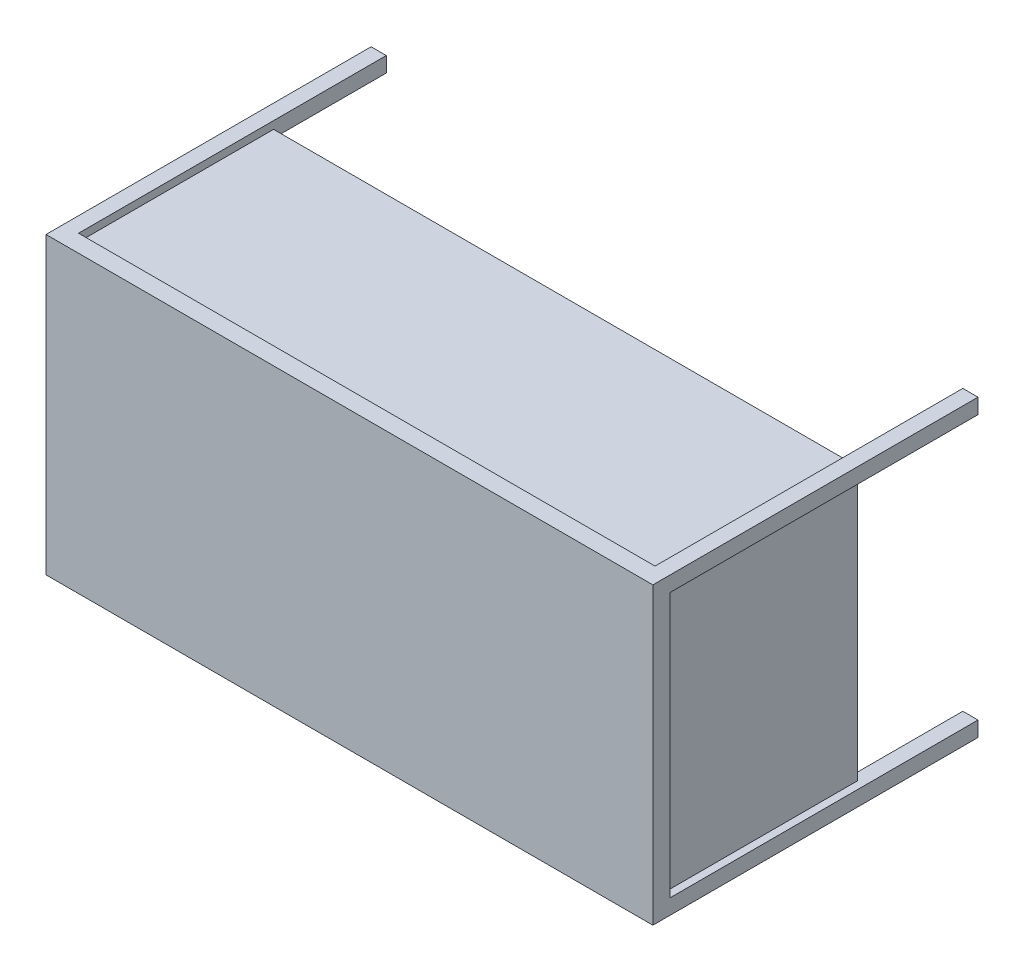
ISO-10303-21;
HEADER;
FILE_DESCRIPTION(('STEP AP214'),'2;1');
FILE_NAME('part.step','',(''),(''),'','','');
FILE_SCHEMA(('AUTOMOTIVE_DESIGN { 1 0 10303 214 1 1 1 1 }'));
ENDSEC;
DATA;
#1=APPLICATION_CONTEXT('core data for automotive mechanical design processes');
#2=APPLICATION_PROTOCOL_DEFINITION('international standard','automotive_design',2000,#1);
#3=PRODUCT_CONTEXT('',#1,'mechanical');
#4=PRODUCT('Part','Part','',(#3));
#5=PRODUCT_RELATED_PRODUCT_CATEGORY('part','',(#4));
#6=PRODUCT_DEFINITION_FORMATION('','',#4);
#7=PRODUCT_DEFINITION_CONTEXT('part definition',#1,'design');
#8=PRODUCT_DEFINITION('design','',#6,#7);
#9=PRODUCT_DEFINITION_SHAPE('','',#8);
#10=(LENGTH_UNIT() NAMED_UNIT(*) SI_UNIT(.MILLI.,.METRE.));
#11=(NAMED_UNIT(*) PLANE_ANGLE_UNIT() SI_UNIT($,.RADIAN.));
#12=(NAMED_UNIT(*) SI_UNIT($,.STERADIAN.) SOLID_ANGLE_UNIT());
#13=UNCERTAINTY_MEASURE_WITH_UNIT(LENGTH_MEASURE(1.E-05),#10,'distance_accuracy_value','');
#14=(GEOMETRIC_REPRESENTATION_CONTEXT(3) GLOBAL_UNCERTAINTY_ASSIGNED_CONTEXT((#13)) GLOBAL_UNIT_ASSIGNED_CONTEXT((#10,
#11,#12)) REPRESENTATION_CONTEXT('',''));
#15=CARTESIAN_POINT('',(0.,0.,0.));
#16=DIRECTION('',(0.,0.,1.));
#17=DIRECTION('',(1.,0.,0.));
#18=AXIS2_PLACEMENT_3D('',#15,#16,#17);
#19=CARTESIAN_POINT('',(0.,0.,0.));
#20=DIRECTION('',(0.,0.,1.));
#21=DIRECTION('',(1.,0.,0.));
#22=AXIS2_PLACEMENT_3D('',#19,#20,#21);
#23=PLANE('',#22);
#24=DIRECTION('',(0.,1.,0.));
#25=VECTOR('',#24,1.);
#26=CARTESIAN_POINT('',(-2.93141989616639,-652.709944633087,0.));
#27=LINE('',#26,#25);
#28=CARTESIAN_POINT('',(-2.93141989616639,-635.209944633087,0.));
#29=VERTEX_POINT('',#28);
#30=CARTESIAN_POINT('',(-2.93141989616639,-25.2099446330869,0.));
#31=VERTEX_POINT('',#30);
#32=EDGE_CURVE('E390',#29,#31,#27,.T.);
#33=ORIENTED_EDGE('',*,*,#32,.F.);
#34=DIRECTION('',(1.,0.,0.));
#35=VECTOR('',#34,1.);
#36=CARTESIAN_POINT('',(-20.4314198961664,-635.209944633087,0.));
#37=LINE('',#36,#35);
#38=CARTESIAN_POINT('',(-20.4314198961664,-635.209944633087,0.));
#39=VERTEX_POINT('',#38);
#40=EDGE_CURVE('E221',#39,#29,#37,.T.);
#41=ORIENTED_EDGE('',*,*,#40,.F.);
#42=DIRECTION('',(0.,-1.,0.));
#43=VECTOR('',#42,1.);
#44=CARTESIAN_POINT('',(-20.4314198961665,9.7900553669131,0.));
#45=LINE('',#44,#43);
#46=CARTESIAN_POINT('',(-20.4314198961665,-25.2099446330869,0.));
#47=VERTEX_POINT('',#46);
#48=EDGE_CURVE('E321',#47,#39,#45,.T.);
#49=ORIENTED_EDGE('',*,*,#48,.F.);
#50=DIRECTION('',(-1.,0.,0.));
#51=VECTOR('',#50,1.);
#52=CARTESIAN_POINT('',(-20.4314198961665,-25.2099446330869,0.));
#53=LINE('',#52,#51);
#54=EDGE_CURVE('E288',#31,#47,#53,.T.);
#55=ORIENTED_EDGE('',*,*,#54,.F.);
#56=EDGE_LOOP('',(#33,#41,#49,#55));
#57=FACE_BOUND('',#56,.T.);
#58=ADVANCED_FACE('F36',(#57),#23,.F.);
#59=DIRECTION('',(-1.,0.,0.));
#60=VECTOR('',#59,1.);
#61=CARTESIAN_POINT('',(-2.93141989616639,-652.709944633087,0.));
#62=LINE('',#61,#60);
#63=CARTESIAN_POINT('',(1344.56858010383,-652.709944633087,0.));
#64=VERTEX_POINT('',#63);
#65=CARTESIAN_POINT('',(14.5685801038336,-652.709944633087,0.));
#66=VERTEX_POINT('',#65);
#67=EDGE_CURVE('E218',#64,#66,#62,.T.);
#68=ORIENTED_EDGE('',*,*,#67,.F.);
#69=DIRECTION('',(0.,1.,0.));
#70=VECTOR('',#69,1.);
#71=CARTESIAN_POINT('',(1344.56858010383,-670.209944633087,0.));
#72=LINE('',#71,#70);
#73=CARTESIAN_POINT('',(1344.56858010383,-670.209944633087,0.));
#74=VERTEX_POINT('',#73);
#75=EDGE_CURVE('E62',#74,#64,#72,.T.);
#76=ORIENTED_EDGE('',*,*,#75,.F.);
#77=DIRECTION('',(1.,0.,0.));
#78=VECTOR('',#77,1.);
#79=CARTESIAN_POINT('',(-20.4314198961664,-670.209944633087,0.));
#80=LINE('',#79,#78);
#81=CARTESIAN_POINT('',(14.5685801038336,-670.209944633087,0.));
#82=VERTEX_POINT('',#81);
#83=EDGE_CURVE('E333',#82,#74,#80,.T.);
#84=ORIENTED_EDGE('',*,*,#83,.F.);
#85=DIRECTION('',(0.,-1.,0.));
#86=VECTOR('',#85,1.);
#87=CARTESIAN_POINT('',(14.5685801038336,-670.209944633087,0.));
#88=LINE('',#87,#86);
#89=EDGE_CURVE('E242',#66,#82,#88,.T.);
#90=ORIENTED_EDGE('',*,*,#89,.F.);
#91=EDGE_LOOP('',(#68,#76,#84,#90));
#92=FACE_BOUND('',#91,.T.);
#93=ADVANCED_FACE('F365',(#92),#23,.F.);
#94=DIRECTION('',(0.,-1.,0.));
#95=VECTOR('',#94,1.);
#96=CARTESIAN_POINT('',(1362.06858010383,-652.709944633087,0.));
#97=LINE('',#96,#95);
#98=CARTESIAN_POINT('',(1362.06858010383,-25.2099446330869,0.));
#99=VERTEX_POINT('',#98);
#100=CARTESIAN_POINT('',(1362.06858010383,-635.209944633087,0.));
#101=VERTEX_POINT('',#100);
#102=EDGE_CURVE('E364',#99,#101,#97,.T.);
#103=ORIENTED_EDGE('',*,*,#102,.F.);
#104=DIRECTION('',(-1.,0.,0.));
#105=VECTOR('',#104,1.);
#106=CARTESIAN_POINT('',(1379.56858010383,-25.2099446330869,0.));
#107=LINE('',#106,#105);
#108=CARTESIAN_POINT('',(1379.56858010383,-25.2099446330869,0.));
#109=VERTEX_POINT('',#108);
#110=EDGE_CURVE('E267',#109,#99,#107,.T.);
#111=ORIENTED_EDGE('',*,*,#110,.F.);
#112=DIRECTION('',(0.,1.,0.));
#113=VECTOR('',#112,1.);
#114=CARTESIAN_POINT('',(1379.56858010383,9.7900553669131,0.));
#115=LINE('',#114,#113);
#116=CARTESIAN_POINT('',(1379.56858010383,-635.209944633087,0.));
#117=VERTEX_POINT('',#116);
#118=EDGE_CURVE('E340',#117,#109,#115,.T.);
#119=ORIENTED_EDGE('',*,*,#118,.F.);
#120=DIRECTION('',(1.,0.,0.));
#121=VECTOR('',#120,1.);
#122=CARTESIAN_POINT('',(1379.56858010383,-635.209944633087,0.));
#123=LINE('',#122,#121);
#124=EDGE_CURVE('E264',#101,#117,#123,.T.);
#125=ORIENTED_EDGE('',*,*,#124,.F.);
#126=EDGE_LOOP('',(#103,#111,#119,#125));
#127=FACE_BOUND('',#126,.T.);
#128=ADVANCED_FACE('F406',(#127),#23,.F.);
#129=DIRECTION('',(1.,0.,0.));
#130=VECTOR('',#129,1.);
#131=CARTESIAN_POINT('',(-2.93141989616639,-7.7099446330869,0.));
#132=LINE('',#131,#130);
#133=CARTESIAN_POINT('',(14.5685801038335,-7.7099446330869,0.));
#134=VERTEX_POINT('',#133);
#135=CARTESIAN_POINT('',(1344.56858010383,-7.7099446330869,0.));
#136=VERTEX_POINT('',#135);
#137=EDGE_CURVE('E386',#134,#136,#132,.T.);
#138=ORIENTED_EDGE('',*,*,#137,.F.);
#139=DIRECTION('',(0.,-1.,0.));
#140=VECTOR('',#139,1.);
#141=CARTESIAN_POINT('',(14.5685801038335,9.7900553669131,0.));
#142=LINE('',#141,#140);
#143=CARTESIAN_POINT('',(14.5685801038335,9.7900553669131,0.));
#144=VERTEX_POINT('',#143);
#145=EDGE_CURVE('E256',#144,#134,#142,.T.);
#146=ORIENTED_EDGE('',*,*,#145,.F.);
#147=DIRECTION('',(-1.,0.,0.));
#148=VECTOR('',#147,1.);
#149=CARTESIAN_POINT('',(-20.4314198961665,9.7900553669131,0.));
#150=LINE('',#149,#148);
#151=CARTESIAN_POINT('',(1344.56858010383,9.7900553669131,0.));
#152=VERTEX_POINT('',#151);
#153=EDGE_CURVE('E326',#152,#144,#150,.T.);
#154=ORIENTED_EDGE('',*,*,#153,.F.);
#155=DIRECTION('',(0.,1.,0.));
#156=VECTOR('',#155,1.);
#157=CARTESIAN_POINT('',(1344.56858010383,9.7900553669131,0.));
#158=LINE('',#157,#156);
#159=EDGE_CURVE('E305',#136,#152,#158,.T.);
#160=ORIENTED_EDGE('',*,*,#159,.F.);
#161=EDGE_LOOP('',(#138,#146,#154,#160));
#162=FACE_BOUND('',#161,.T.);
#163=ADVANCED_FACE('F444',(#162),#23,.F.);
#164=CARTESIAN_POINT('',(1379.56858010383,-25.2099446330869,-710.));
#165=DIRECTION('',(0.,1.,0.));
#166=DIRECTION('',(0.,0.,1.));
#167=AXIS2_PLACEMENT_3D('',#164,#165,#166);
#168=PLANE('',#167);
#169=DIRECTION('',(0.,0.,1.));
#170=VECTOR('',#169,1.);
#171=CARTESIAN_POINT('',(1362.06858010383,-25.2099446330869,-710.));
#172=LINE('',#171,#170);
#173=CARTESIAN_POINT('',(1362.06858010383,-25.2099446330869,-450.));
#174=VERTEX_POINT('',#173);
#175=EDGE_CURVE('E228',#174,#99,#172,.T.);
#176=ORIENTED_EDGE('',*,*,#175,.F.);
#177=DIRECTION('',(-1.,0.,0.));
#178=VECTOR('',#177,1.);
#179=CARTESIAN_POINT('',(1379.56858010383,-25.2099446330869,-450.));
#180=LINE('',#179,#178);
#181=CARTESIAN_POINT('',(1344.56858010383,-25.2099446330869,-450.));
#182=VERTEX_POINT('',#181);
#183=EDGE_CURVE('E400',#174,#182,#180,.T.);
#184=ORIENTED_EDGE('',*,*,#183,.T.);
#185=DIRECTION('',(0.,0.,1.));
#186=VECTOR('',#185,1.);
#187=CARTESIAN_POINT('',(1344.56858010383,-25.2099446330869,-710.));
#188=LINE('',#187,#186);
#189=CARTESIAN_POINT('',(1344.56858010383,-25.2099446330869,-710.));
#190=VERTEX_POINT('',#189);
#191=EDGE_CURVE('E312',#190,#182,#188,.T.);
#192=ORIENTED_EDGE('',*,*,#191,.F.);
#193=DIRECTION('',(-1.,0.,0.));
#194=VECTOR('',#193,1.);
#195=CARTESIAN_POINT('',(1379.56858010383,-25.2099446330869,-710.));
#196=LINE('',#195,#194);
#197=CARTESIAN_POINT('',(1379.56858010383,-25.2099446330869,-710.));
#198=VERTEX_POINT('',#197);
#199=EDGE_CURVE('E301',#198,#190,#196,.T.);
#200=ORIENTED_EDGE('',*,*,#199,.F.);
#201=DIRECTION('',(0.,0.,1.));
#202=VECTOR('',#201,1.);
#203=CARTESIAN_POINT('',(1379.56858010383,-25.2099446330869,-710.));
#204=LINE('',#203,#202);
#205=EDGE_CURVE('E318',#198,#109,#204,.T.);
#206=ORIENTED_EDGE('',*,*,#205,.T.);
#207=ORIENTED_EDGE('',*,*,#110,.T.);
#208=EDGE_LOOP('',(#176,#184,#192,#200,#206,#207));
#209=FACE_BOUND('',#208,.T.);
#210=ADVANCED_FACE('F411',(#209),#168,.F.);
#211=CARTESIAN_POINT('',(1344.56858010383,9.7900553669131,-710.));
#212=DIRECTION('',(1.,0.,0.));
#213=DIRECTION('',(0.,0.,-1.));
#214=AXIS2_PLACEMENT_3D('',#211,#212,#213);
#215=PLANE('',#214);
#216=DIRECTION('',(0.,0.,-1.));
#217=VECTOR('',#216,1.);
#218=CARTESIAN_POINT('',(1344.56858010383,-7.7099446330869,-710.));
#219=LINE('',#218,#217);
#220=CARTESIAN_POINT('',(1344.56858010383,-7.7099446330869,-450.));
#221=VERTEX_POINT('',#220);
#222=EDGE_CURVE('E223',#136,#221,#219,.T.);
#223=ORIENTED_EDGE('',*,*,#222,.F.);
#224=ORIENTED_EDGE('',*,*,#159,.T.);
#225=DIRECTION('',(0.,0.,1.));
#226=VECTOR('',#225,1.);
#227=CARTESIAN_POINT('',(1344.56858010383,9.7900553669131,-710.));
#228=LINE('',#227,#226);
#229=CARTESIAN_POINT('',(1344.56858010383,9.7900553669131,-710.));
#230=VERTEX_POINT('',#229);
#231=EDGE_CURVE('E310',#230,#152,#228,.T.);
#232=ORIENTED_EDGE('',*,*,#231,.F.);
#233=DIRECTION('',(0.,1.,0.));
#234=VECTOR('',#233,1.);
#235=CARTESIAN_POINT('',(1344.56858010383,9.7900553669131,-710.));
#236=LINE('',#235,#234);
#237=EDGE_CURVE('E303',#190,#230,#236,.T.);
#238=ORIENTED_EDGE('',*,*,#237,.F.);
#239=ORIENTED_EDGE('',*,*,#191,.T.);
#240=DIRECTION('',(0.,1.,0.));
#241=VECTOR('',#240,1.);
#242=CARTESIAN_POINT('',(1344.56858010383,9.7900553669131,-450.));
#243=LINE('',#242,#241);
#244=EDGE_CURVE('E211',#182,#221,#243,.T.);
#245=ORIENTED_EDGE('',*,*,#244,.T.);
#246=EDGE_LOOP('',(#223,#224,#232,#238,#239,#245));
#247=FACE_BOUND('',#246,.T.);
#248=ADVANCED_FACE('F451',(#247),#215,.F.);
#249=CARTESIAN_POINT('',(-20.4314198961664,-635.209944633087,-710.));
#250=DIRECTION('',(0.,-1.,0.));
#251=DIRECTION('',(0.,0.,-1.));
#252=AXIS2_PLACEMENT_3D('',#249,#250,#251);
#253=PLANE('',#252);
#254=DIRECTION('',(0.,0.,1.));
#255=VECTOR('',#254,1.);
#256=CARTESIAN_POINT('',(-2.93141989616639,-635.209944633087,-710.));
#257=LINE('',#256,#255);
#258=CARTESIAN_POINT('',(-2.93141989616639,-635.209944633087,-450.));
#259=VERTEX_POINT('',#258);
#260=EDGE_CURVE('E214',#259,#29,#257,.T.);
#261=ORIENTED_EDGE('',*,*,#260,.F.);
#262=DIRECTION('',(1.,0.,0.));
#263=VECTOR('',#262,1.);
#264=CARTESIAN_POINT('',(-20.4314198961664,-635.209944633087,-450.));
#265=LINE('',#264,#263);
#266=CARTESIAN_POINT('',(14.5685801038336,-635.209944633087,-450.));
#267=VERTEX_POINT('',#266);
#268=EDGE_CURVE('E200',#259,#267,#265,.T.);
#269=ORIENTED_EDGE('',*,*,#268,.T.);
#270=DIRECTION('',(0.,0.,1.));
#271=VECTOR('',#270,1.);
#272=CARTESIAN_POINT('',(14.5685801038336,-635.209944633087,-710.));
#273=LINE('',#272,#271);
#274=CARTESIAN_POINT('',(14.5685801038336,-635.209944633087,-710.));
#275=VERTEX_POINT('',#274);
#276=EDGE_CURVE('E231',#275,#267,#273,.T.);
#277=ORIENTED_EDGE('',*,*,#276,.F.);
#278=DIRECTION('',(1.,0.,0.));
#279=VECTOR('',#278,1.);
#280=CARTESIAN_POINT('',(-20.4314198961664,-635.209944633087,-710.));
#281=LINE('',#280,#279);
#282=CARTESIAN_POINT('',(-20.4314198961664,-635.209944633087,-710.));
#283=VERTEX_POINT('',#282);
#284=EDGE_CURVE('E249',#283,#275,#281,.T.);
#285=ORIENTED_EDGE('',*,*,#284,.F.);
#286=DIRECTION('',(0.,0.,1.));
#287=VECTOR('',#286,1.);
#288=CARTESIAN_POINT('',(-20.4314198961664,-635.209944633087,-710.));
#289=LINE('',#288,#287);
#290=EDGE_CURVE('E229',#283,#39,#289,.T.);
#291=ORIENTED_EDGE('',*,*,#290,.T.);
#292=ORIENTED_EDGE('',*,*,#40,.T.);
#293=EDGE_LOOP('',(#261,#269,#277,#285,#291,#292));
#294=FACE_BOUND('',#293,.T.);
#295=ADVANCED_FACE('F225',(#294),#253,.F.);
#296=CARTESIAN_POINT('',(14.5685801038336,-670.209944633087,-710.));
#297=DIRECTION('',(-1.,0.,0.));
#298=DIRECTION('',(0.,0.,1.));
#299=AXIS2_PLACEMENT_3D('',#296,#297,#298);
#300=PLANE('',#299);
#301=DIRECTION('',(0.,0.,-1.));
#302=VECTOR('',#301,1.);
#303=CARTESIAN_POINT('',(14.5685801038336,-652.709944633087,-710.));
#304=LINE('',#303,#302);
#305=CARTESIAN_POINT('',(14.5685801038336,-652.709944633087,-450.));
#306=VERTEX_POINT('',#305);
#307=EDGE_CURVE('E227',#66,#306,#304,.T.);
#308=ORIENTED_EDGE('',*,*,#307,.F.);
#309=ORIENTED_EDGE('',*,*,#89,.T.);
#310=DIRECTION('',(0.,0.,1.));
#311=VECTOR('',#310,1.);
#312=CARTESIAN_POINT('',(14.5685801038336,-670.209944633087,-710.));
#313=LINE('',#312,#311);
#314=CARTESIAN_POINT('',(14.5685801038336,-670.209944633087,-710.));
#315=VERTEX_POINT('',#314);
#316=EDGE_CURVE('E240',#315,#82,#313,.T.);
#317=ORIENTED_EDGE('',*,*,#316,.F.);
#318=DIRECTION('',(0.,-1.,0.));
#319=VECTOR('',#318,1.);
#320=CARTESIAN_POINT('',(14.5685801038336,-670.209944633087,-710.));
#321=LINE('',#320,#319);
#322=EDGE_CURVE('E247',#275,#315,#321,.T.);
#323=ORIENTED_EDGE('',*,*,#322,.F.);
#324=ORIENTED_EDGE('',*,*,#276,.T.);
#325=DIRECTION('',(0.,-1.,0.));
#326=VECTOR('',#325,1.);
#327=CARTESIAN_POINT('',(14.5685801038336,-670.209944633087,-450.));
#328=LINE('',#327,#326);
#329=EDGE_CURVE('E206',#267,#306,#328,.T.);
#330=ORIENTED_EDGE('',*,*,#329,.T.);
#331=EDGE_LOOP('',(#308,#309,#317,#323,#324,#330));
#332=FACE_BOUND('',#331,.T.);
#333=ADVANCED_FACE('F377',(#332),#300,.F.);
#334=CARTESIAN_POINT('',(14.5685801038335,9.7900553669131,-710.));
#335=DIRECTION('',(-1.,0.,0.));
#336=DIRECTION('',(0.,-1.,0.));
#337=AXIS2_PLACEMENT_3D('',#334,#335,#336);
#338=PLANE('',#337);
#339=DIRECTION('',(0.,0.,1.));
#340=VECTOR('',#339,1.);
#341=CARTESIAN_POINT('',(14.5685801038335,-7.7099446330869,-710.));
#342=LINE('',#341,#340);
#343=CARTESIAN_POINT('',(14.5685801038335,-7.7099446330869,-450.));
#344=VERTEX_POINT('',#343);
#345=EDGE_CURVE('E11',#344,#134,#342,.T.);
#346=ORIENTED_EDGE('',*,*,#345,.F.);
#347=DIRECTION('',(0.,-1.,0.));
#348=VECTOR('',#347,1.);
#349=CARTESIAN_POINT('',(14.5685801038335,9.7900553669131,-450.));
#350=LINE('',#349,#348);
#351=CARTESIAN_POINT('',(14.5685801038335,-25.2099446330869,-450.));
#352=VERTEX_POINT('',#351);
#353=EDGE_CURVE('E394',#344,#352,#350,.T.);
#354=ORIENTED_EDGE('',*,*,#353,.T.);
#355=DIRECTION('',(0.,0.,1.));
#356=VECTOR('',#355,1.);
#357=CARTESIAN_POINT('',(14.5685801038335,-25.2099446330869,-710.));
#358=LINE('',#357,#356);
#359=CARTESIAN_POINT('',(14.5685801038335,-25.2099446330869,-710.));
#360=VERTEX_POINT('',#359);
#361=EDGE_CURVE('E276',#360,#352,#358,.T.);
#362=ORIENTED_EDGE('',*,*,#361,.F.);
#363=DIRECTION('',(0.,-1.,0.));
#364=VECTOR('',#363,1.);
#365=CARTESIAN_POINT('',(14.5685801038335,9.7900553669131,-710.));
#366=LINE('',#365,#364);
#367=CARTESIAN_POINT('',(14.5685801038335,9.7900553669131,-710.));
#368=VERTEX_POINT('',#367);
#369=EDGE_CURVE('E295',#368,#360,#366,.T.);
#370=ORIENTED_EDGE('',*,*,#369,.F.);
#371=DIRECTION('',(0.,0.,1.));
#372=VECTOR('',#371,1.);
#373=CARTESIAN_POINT('',(14.5685801038335,9.7900553669131,-710.));
#374=LINE('',#373,#372);
#375=EDGE_CURVE('E243',#368,#144,#374,.T.);
#376=ORIENTED_EDGE('',*,*,#375,.T.);
#377=ORIENTED_EDGE('',*,*,#145,.T.);
#378=EDGE_LOOP('',(#346,#354,#362,#370,#376,#377));
#379=FACE_BOUND('',#378,.T.);
#380=ADVANCED_FACE('F464',(#379),#338,.F.);
#381=CARTESIAN_POINT('',(-20.4314198961665,-25.2099446330869,-710.));
#382=DIRECTION('',(0.,1.,0.));
#383=DIRECTION('',(-1.,0.,0.));
#384=AXIS2_PLACEMENT_3D('',#381,#382,#383);
#385=PLANE('',#384);
#386=DIRECTION('',(0.,0.,-1.));
#387=VECTOR('',#386,1.);
#388=CARTESIAN_POINT('',(-2.93141989616639,-25.2099446330869,-710.));
#389=LINE('',#388,#387);
#390=CARTESIAN_POINT('',(-2.93141989616639,-25.2099446330869,-450.));
#391=VERTEX_POINT('',#390);
#392=EDGE_CURVE('E46',#31,#391,#389,.T.);
#393=ORIENTED_EDGE('',*,*,#392,.F.);
#394=ORIENTED_EDGE('',*,*,#54,.T.);
#395=DIRECTION('',(0.,0.,1.));
#396=VECTOR('',#395,1.);
#397=CARTESIAN_POINT('',(-20.4314198961665,-25.2099446330869,-710.));
#398=LINE('',#397,#396);
#399=CARTESIAN_POINT('',(-20.4314198961665,-25.2099446330869,-710.));
#400=VERTEX_POINT('',#399);
#401=EDGE_CURVE('E285',#400,#47,#398,.T.);
#402=ORIENTED_EDGE('',*,*,#401,.F.);
#403=DIRECTION('',(-1.,0.,0.));
#404=VECTOR('',#403,1.);
#405=CARTESIAN_POINT('',(-20.4314198961665,-25.2099446330869,-710.));
#406=LINE('',#405,#404);
#407=EDGE_CURVE('E283',#360,#400,#406,.T.);
#408=ORIENTED_EDGE('',*,*,#407,.F.);
#409=ORIENTED_EDGE('',*,*,#361,.T.);
#410=DIRECTION('',(-1.,0.,0.));
#411=VECTOR('',#410,1.);
#412=CARTESIAN_POINT('',(-20.4314198961665,-25.2099446330869,-450.));
#413=LINE('',#412,#411);
#414=EDGE_CURVE('E385',#352,#391,#413,.T.);
#415=ORIENTED_EDGE('',*,*,#414,.T.);
#416=EDGE_LOOP('',(#393,#394,#402,#408,#409,#415));
#417=FACE_BOUND('',#416,.T.);
#418=ADVANCED_FACE('F479',(#417),#385,.F.);
#419=CARTESIAN_POINT('',(1344.56858010383,-670.209944633087,-710.));
#420=DIRECTION('',(1.,0.,0.));
#421=DIRECTION('',(0.,0.,-1.));
#422=AXIS2_PLACEMENT_3D('',#419,#420,#421);
#423=PLANE('',#422);
#424=DIRECTION('',(0.,0.,1.));
#425=VECTOR('',#424,1.);
#426=CARTESIAN_POINT('',(1344.56858010383,-652.709944633087,-710.));
#427=LINE('',#426,#425);
#428=CARTESIAN_POINT('',(1344.56858010383,-652.709944633087,-450.));
#429=VERTEX_POINT('',#428);
#430=EDGE_CURVE('E351',#429,#64,#427,.T.);
#431=ORIENTED_EDGE('',*,*,#430,.F.);
#432=DIRECTION('',(0.,1.,0.));
#433=VECTOR('',#432,1.);
#434=CARTESIAN_POINT('',(1344.56858010383,-670.209944633087,-450.));
#435=LINE('',#434,#433);
#436=CARTESIAN_POINT('',(1344.56858010383,-635.209944633087,-450.));
#437=VERTEX_POINT('',#436);
#438=EDGE_CURVE('E379',#429,#437,#435,.T.);
#439=ORIENTED_EDGE('',*,*,#438,.T.);
#440=DIRECTION('',(0.,0.,1.));
#441=VECTOR('',#440,1.);
#442=CARTESIAN_POINT('',(1344.56858010383,-635.209944633087,-710.));
#443=LINE('',#442,#441);
#444=CARTESIAN_POINT('',(1344.56858010383,-635.209944633087,-710.));
#445=VERTEX_POINT('',#444);
#446=EDGE_CURVE('E260',#445,#437,#443,.T.);
#447=ORIENTED_EDGE('',*,*,#446,.F.);
#448=DIRECTION('',(0.,1.,0.));
#449=VECTOR('',#448,1.);
#450=CARTESIAN_POINT('',(1344.56858010383,-670.209944633087,-710.));
#451=LINE('',#450,#449);
#452=CARTESIAN_POINT('',(1344.56858010383,-670.209944633087,-710.));
#453=VERTEX_POINT('',#452);
#454=EDGE_CURVE('E271',#453,#445,#451,.T.);
#455=ORIENTED_EDGE('',*,*,#454,.F.);
#456=DIRECTION('',(0.,0.,1.));
#457=VECTOR('',#456,1.);
#458=CARTESIAN_POINT('',(1344.56858010383,-670.209944633087,-710.));
#459=LINE('',#458,#457);
#460=EDGE_CURVE('E255',#453,#74,#459,.T.);
#461=ORIENTED_EDGE('',*,*,#460,.T.);
#462=ORIENTED_EDGE('',*,*,#75,.T.);
#463=EDGE_LOOP('',(#431,#439,#447,#455,#461,#462));
#464=FACE_BOUND('',#463,.T.);
#465=ADVANCED_FACE('F370',(#464),#423,.F.);
#466=CARTESIAN_POINT('',(1379.56858010383,-635.209944633087,-710.));
#467=DIRECTION('',(0.,-1.,0.));
#468=DIRECTION('',(0.,0.,-1.));
#469=AXIS2_PLACEMENT_3D('',#466,#467,#468);
#470=PLANE('',#469);
#471=DIRECTION('',(0.,0.,-1.));
#472=VECTOR('',#471,1.);
#473=CARTESIAN_POINT('',(1362.06858010383,-635.209944633087,-710.));
#474=LINE('',#473,#472);
#475=CARTESIAN_POINT('',(1362.06858010383,-635.209944633087,-450.));
#476=VERTEX_POINT('',#475);
#477=EDGE_CURVE('E355',#101,#476,#474,.T.);
#478=ORIENTED_EDGE('',*,*,#477,.F.);
#479=ORIENTED_EDGE('',*,*,#124,.T.);
#480=DIRECTION('',(0.,0.,1.));
#481=VECTOR('',#480,1.);
#482=CARTESIAN_POINT('',(1379.56858010383,-635.209944633087,-710.));
#483=LINE('',#482,#481);
#484=CARTESIAN_POINT('',(1379.56858010383,-635.209944633087,-710.));
#485=VERTEX_POINT('',#484);
#486=EDGE_CURVE('E261',#485,#117,#483,.T.);
#487=ORIENTED_EDGE('',*,*,#486,.F.);
#488=DIRECTION('',(1.,0.,0.));
#489=VECTOR('',#488,1.);
#490=CARTESIAN_POINT('',(1379.56858010383,-635.209944633087,-710.));
#491=LINE('',#490,#489);
#492=EDGE_CURVE('E262',#445,#485,#491,.T.);
#493=ORIENTED_EDGE('',*,*,#492,.F.);
#494=ORIENTED_EDGE('',*,*,#446,.T.);
#495=DIRECTION('',(1.,0.,0.));
#496=VECTOR('',#495,1.);
#497=CARTESIAN_POINT('',(1379.56858010383,-635.209944633087,-450.));
#498=LINE('',#497,#496);
#499=EDGE_CURVE('E349',#437,#476,#498,.T.);
#500=ORIENTED_EDGE('',*,*,#499,.T.);
#501=EDGE_LOOP('',(#478,#479,#487,#493,#494,#500));
#502=FACE_BOUND('',#501,.T.);
#503=ADVANCED_FACE('F425',(#502),#470,.F.);
#504=CARTESIAN_POINT('',(-20.4314198961665,9.7900553669131,40.));
#505=DIRECTION('',(1.,0.,0.));
#506=DIRECTION('',(0.,1.,0.));
#507=AXIS2_PLACEMENT_3D('',#504,#505,#506);
#508=PLANE('',#507);
#509=DIRECTION('',(0.,0.,-1.));
#510=VECTOR('',#509,1.);
#511=CARTESIAN_POINT('',(-20.4314198961665,9.7900553669131,40.));
#512=LINE('',#511,#510);
#513=CARTESIAN_POINT('',(-20.4314198961665,9.7900553669131,40.));
#514=VERTEX_POINT('',#513);
#515=CARTESIAN_POINT('',(-20.4314198961665,9.7900553669131,-710.));
#516=VERTEX_POINT('',#515);
#517=EDGE_CURVE('E335',#514,#516,#512,.T.);
#518=ORIENTED_EDGE('',*,*,#517,.T.);
#519=DIRECTION('',(0.,1.,0.));
#520=VECTOR('',#519,1.);
#521=CARTESIAN_POINT('',(-20.4314198961665,9.7900553669131,-710.));
#522=LINE('',#521,#520);
#523=EDGE_CURVE('E287',#400,#516,#522,.T.);
#524=ORIENTED_EDGE('',*,*,#523,.F.);
#525=ORIENTED_EDGE('',*,*,#401,.T.);
#526=ORIENTED_EDGE('',*,*,#48,.T.);
#527=ORIENTED_EDGE('',*,*,#290,.F.);
#528=DIRECTION('',(0.,1.,0.));
#529=VECTOR('',#528,1.);
#530=CARTESIAN_POINT('',(-20.4314198961664,-670.209944633087,-710.));
#531=LINE('',#530,#529);
#532=CARTESIAN_POINT('',(-20.4314198961664,-670.209944633087,-710.));
#533=VERTEX_POINT('',#532);
#534=EDGE_CURVE('E244',#533,#283,#531,.T.);
#535=ORIENTED_EDGE('',*,*,#534,.F.);
#536=DIRECTION('',(0.,0.,-1.));
#537=VECTOR('',#536,1.);
#538=CARTESIAN_POINT('',(-20.4314198961664,-670.209944633087,40.));
#539=LINE('',#538,#537);
#540=CARTESIAN_POINT('',(-20.4314198961664,-670.209944633087,40.));
#541=VERTEX_POINT('',#540);
#542=EDGE_CURVE('E350',#541,#533,#539,.T.);
#543=ORIENTED_EDGE('',*,*,#542,.F.);
#544=DIRECTION('',(0.,-1.,0.));
#545=VECTOR('',#544,1.);
#546=CARTESIAN_POINT('',(-20.4314198961665,9.7900553669131,40.));
#547=LINE('',#546,#545);
#548=EDGE_CURVE('E325',#514,#541,#547,.T.);
#549=ORIENTED_EDGE('',*,*,#548,.F.);
#550=EDGE_LOOP('',(#518,#524,#525,#526,#527,#535,#543,#549));
#551=FACE_BOUND('',#550,.T.);
#552=ADVANCED_FACE('F37',(#551),#508,.F.);
#553=CARTESIAN_POINT('',(-20.4314198961664,-670.209944633087,40.));
#554=DIRECTION('',(0.,1.,0.));
#555=DIRECTION('',(0.,0.,1.));
#556=AXIS2_PLACEMENT_3D('',#553,#554,#555);
#557=PLANE('',#556);
#558=ORIENTED_EDGE('',*,*,#542,.T.);
#559=DIRECTION('',(-1.,0.,0.));
#560=VECTOR('',#559,1.);
#561=CARTESIAN_POINT('',(-20.4314198961664,-670.209944633087,-710.));
#562=LINE('',#561,#560);
#563=EDGE_CURVE('E238',#315,#533,#562,.T.);
#564=ORIENTED_EDGE('',*,*,#563,.F.);
#565=ORIENTED_EDGE('',*,*,#316,.T.);
#566=ORIENTED_EDGE('',*,*,#83,.T.);
#567=ORIENTED_EDGE('',*,*,#460,.F.);
#568=DIRECTION('',(-1.,0.,0.));
#569=VECTOR('',#568,1.);
#570=CARTESIAN_POINT('',(1379.56858010383,-670.209944633087,-710.));
#571=LINE('',#570,#569);
#572=CARTESIAN_POINT('',(1379.56858010383,-670.209944633087,-710.));
#573=VERTEX_POINT('',#572);
#574=EDGE_CURVE('E272',#573,#453,#571,.T.);
#575=ORIENTED_EDGE('',*,*,#574,.F.);
#576=DIRECTION('',(0.,0.,-1.));
#577=VECTOR('',#576,1.);
#578=CARTESIAN_POINT('',(1379.56858010383,-670.209944633087,40.));
#579=LINE('',#578,#577);
#580=CARTESIAN_POINT('',(1379.56858010383,-670.209944633087,40.));
#581=VERTEX_POINT('',#580);
#582=EDGE_CURVE('E341',#581,#573,#579,.T.);
#583=ORIENTED_EDGE('',*,*,#582,.F.);
#584=DIRECTION('',(1.,0.,0.));
#585=VECTOR('',#584,1.);
#586=CARTESIAN_POINT('',(-20.4314198961664,-670.209944633087,40.));
#587=LINE('',#586,#585);
#588=EDGE_CURVE('E324',#541,#581,#587,.T.);
#589=ORIENTED_EDGE('',*,*,#588,.F.);
#590=EDGE_LOOP('',(#558,#564,#565,#566,#567,#575,#583,#589));
#591=FACE_BOUND('',#590,.T.);
#592=ADVANCED_FACE('F373',(#591),#557,.F.);
#593=CARTESIAN_POINT('',(1379.56858010383,9.7900553669131,40.));
#594=DIRECTION('',(-1.,0.,0.));
#595=DIRECTION('',(0.,0.,1.));
#596=AXIS2_PLACEMENT_3D('',#593,#594,#595);
#597=PLANE('',#596);
#598=ORIENTED_EDGE('',*,*,#582,.T.);
#599=DIRECTION('',(0.,-1.,0.));
#600=VECTOR('',#599,1.);
#601=CARTESIAN_POINT('',(1379.56858010383,-670.209944633087,-710.));
#602=LINE('',#601,#600);
#603=EDGE_CURVE('E270',#485,#573,#602,.T.);
#604=ORIENTED_EDGE('',*,*,#603,.F.);
#605=ORIENTED_EDGE('',*,*,#486,.T.);
#606=ORIENTED_EDGE('',*,*,#118,.T.);
#607=ORIENTED_EDGE('',*,*,#205,.F.);
#608=DIRECTION('',(0.,-1.,0.));
#609=VECTOR('',#608,1.);
#610=CARTESIAN_POINT('',(1379.56858010383,9.7900553669131,-710.));
#611=LINE('',#610,#609);
#612=CARTESIAN_POINT('',(1379.56858010383,9.7900553669131,-710.));
#613=VERTEX_POINT('',#612);
#614=EDGE_CURVE('E299',#613,#198,#611,.T.);
#615=ORIENTED_EDGE('',*,*,#614,.F.);
#616=DIRECTION('',(0.,0.,-1.));
#617=VECTOR('',#616,1.);
#618=CARTESIAN_POINT('',(1379.56858010383,9.7900553669131,40.));
#619=LINE('',#618,#617);
#620=CARTESIAN_POINT('',(1379.56858010383,9.7900553669131,40.));
#621=VERTEX_POINT('',#620);
#622=EDGE_CURVE('E342',#621,#613,#619,.T.);
#623=ORIENTED_EDGE('',*,*,#622,.F.);
#624=DIRECTION('',(0.,1.,0.));
#625=VECTOR('',#624,1.);
#626=CARTESIAN_POINT('',(1379.56858010383,9.7900553669131,40.));
#627=LINE('',#626,#625);
#628=EDGE_CURVE('E327',#581,#621,#627,.T.);
#629=ORIENTED_EDGE('',*,*,#628,.F.);
#630=EDGE_LOOP('',(#598,#604,#605,#606,#607,#615,#623,#629));
#631=FACE_BOUND('',#630,.T.);
#632=ADVANCED_FACE('F418',(#631),#597,.F.);
#633=CARTESIAN_POINT('',(-20.4314198961665,9.7900553669131,40.));
#634=DIRECTION('',(0.,-1.,0.));
#635=DIRECTION('',(0.,0.,-1.));
#636=AXIS2_PLACEMENT_3D('',#633,#634,#635);
#637=PLANE('',#636);
#638=ORIENTED_EDGE('',*,*,#622,.T.);
#639=DIRECTION('',(1.,0.,0.));
#640=VECTOR('',#639,1.);
#641=CARTESIAN_POINT('',(1379.56858010383,9.7900553669131,-710.));
#642=LINE('',#641,#640);
#643=EDGE_CURVE('E308',#230,#613,#642,.T.);
#644=ORIENTED_EDGE('',*,*,#643,.F.);
#645=ORIENTED_EDGE('',*,*,#231,.T.);
#646=ORIENTED_EDGE('',*,*,#153,.T.);
#647=ORIENTED_EDGE('',*,*,#375,.F.);
#648=DIRECTION('',(1.,0.,0.));
#649=VECTOR('',#648,1.);
#650=CARTESIAN_POINT('',(-20.4314198961665,9.7900553669131,-710.));
#651=LINE('',#650,#649);
#652=EDGE_CURVE('E294',#516,#368,#651,.T.);
#653=ORIENTED_EDGE('',*,*,#652,.F.);
#654=ORIENTED_EDGE('',*,*,#517,.F.);
#655=DIRECTION('',(-1.,0.,0.));
#656=VECTOR('',#655,1.);
#657=CARTESIAN_POINT('',(-20.4314198961665,9.7900553669131,40.));
#658=LINE('',#657,#656);
#659=EDGE_CURVE('E329',#621,#514,#658,.T.);
#660=ORIENTED_EDGE('',*,*,#659,.F.);
#661=EDGE_LOOP('',(#638,#644,#645,#646,#647,#653,#654,#660));
#662=FACE_BOUND('',#661,.T.);
#663=ADVANCED_FACE('F468',(#662),#637,.F.);
#664=CARTESIAN_POINT('',(0.,0.,40.));
#665=DIRECTION('',(0.,0.,1.));
#666=DIRECTION('',(1.,0.,0.));
#667=AXIS2_PLACEMENT_3D('',#664,#665,#666);
#668=PLANE('',#667);
#669=ORIENTED_EDGE('',*,*,#548,.T.);
#670=ORIENTED_EDGE('',*,*,#588,.T.);
#671=ORIENTED_EDGE('',*,*,#628,.T.);
#672=ORIENTED_EDGE('',*,*,#659,.T.);
#673=EDGE_LOOP('',(#669,#670,#671,#672));
#674=FACE_BOUND('',#673,.T.);
#675=ADVANCED_FACE('F490',(#674),#668,.T.);
#676=CARTESIAN_POINT('',(0.,0.,-710.));
#677=DIRECTION('',(0.,0.,-1.));
#678=DIRECTION('',(-1.,0.,0.));
#679=AXIS2_PLACEMENT_3D('',#676,#677,#678);
#680=PLANE('',#679);
#681=ORIENTED_EDGE('',*,*,#614,.T.);
#682=ORIENTED_EDGE('',*,*,#199,.T.);
#683=ORIENTED_EDGE('',*,*,#237,.T.);
#684=ORIENTED_EDGE('',*,*,#643,.T.);
#685=EDGE_LOOP('',(#681,#682,#683,#684));
#686=FACE_BOUND('',#685,.T.);
#687=ADVANCED_FACE('F494',(#686),#680,.T.);
#688=CARTESIAN_POINT('',(0.,0.,-710.));
#689=DIRECTION('',(0.,0.,-1.));
#690=DIRECTION('',(-1.,0.,0.));
#691=AXIS2_PLACEMENT_3D('',#688,#689,#690);
#692=PLANE('',#691);
#693=ORIENTED_EDGE('',*,*,#534,.T.);
#694=ORIENTED_EDGE('',*,*,#284,.T.);
#695=ORIENTED_EDGE('',*,*,#322,.T.);
#696=ORIENTED_EDGE('',*,*,#563,.T.);
#697=EDGE_LOOP('',(#693,#694,#695,#696));
#698=FACE_BOUND('',#697,.T.);
#699=ADVANCED_FACE('F436',(#698),#692,.T.);
#700=CARTESIAN_POINT('',(0.,0.,-710.));
#701=DIRECTION('',(0.,0.,1.));
#702=DIRECTION('',(1.,0.,0.));
#703=AXIS2_PLACEMENT_3D('',#700,#701,#702);
#704=PLANE('',#703);
#705=ORIENTED_EDGE('',*,*,#523,.T.);
#706=ORIENTED_EDGE('',*,*,#652,.T.);
#707=ORIENTED_EDGE('',*,*,#369,.T.);
#708=ORIENTED_EDGE('',*,*,#407,.T.);
#709=EDGE_LOOP('',(#705,#706,#707,#708));
#710=FACE_BOUND('',#709,.T.);
#711=ADVANCED_FACE('F430',(#710),#704,.F.);
#712=CARTESIAN_POINT('',(0.,0.,-710.));
#713=DIRECTION('',(0.,0.,1.));
#714=DIRECTION('',(1.,0.,0.));
#715=AXIS2_PLACEMENT_3D('',#712,#713,#714);
#716=PLANE('',#715);
#717=ORIENTED_EDGE('',*,*,#603,.T.);
#718=ORIENTED_EDGE('',*,*,#574,.T.);
#719=ORIENTED_EDGE('',*,*,#454,.T.);
#720=ORIENTED_EDGE('',*,*,#492,.T.);
#721=EDGE_LOOP('',(#717,#718,#719,#720));
#722=FACE_BOUND('',#721,.T.);
#723=ADVANCED_FACE('F424',(#722),#716,.F.);
#724=CARTESIAN_POINT('',(-2.93141989616639,-7.7099446330869,-450.));
#725=DIRECTION('',(0.,-1.,0.));
#726=DIRECTION('',(0.,0.,-1.));
#727=AXIS2_PLACEMENT_3D('',#724,#725,#726);
#728=PLANE('',#727);
#729=ORIENTED_EDGE('',*,*,#137,.T.);
#730=ORIENTED_EDGE('',*,*,#222,.T.);
#731=DIRECTION('',(1.,0.,0.));
#732=VECTOR('',#731,1.);
#733=CARTESIAN_POINT('',(-2.93141989616639,-7.7099446330869,-450.));
#734=LINE('',#733,#732);
#735=EDGE_CURVE('E217',#344,#221,#734,.T.);
#736=ORIENTED_EDGE('',*,*,#735,.F.);
#737=ORIENTED_EDGE('',*,*,#345,.T.);
#738=EDGE_LOOP('',(#729,#730,#736,#737));
#739=FACE_BOUND('',#738,.T.);
#740=ADVANCED_FACE('F426',(#739),#728,.F.);
#741=CARTESIAN_POINT('',(-2.93141989616639,-652.709944633087,-450.));
#742=DIRECTION('',(1.,0.,0.));
#743=DIRECTION('',(0.,0.,-1.));
#744=AXIS2_PLACEMENT_3D('',#741,#742,#743);
#745=PLANE('',#744);
#746=DIRECTION('',(0.,1.,0.));
#747=VECTOR('',#746,1.);
#748=CARTESIAN_POINT('',(-2.93141989616639,-652.709944633087,-450.));
#749=LINE('',#748,#747);
#750=EDGE_CURVE('E205',#259,#391,#749,.T.);
#751=ORIENTED_EDGE('',*,*,#750,.F.);
#752=ORIENTED_EDGE('',*,*,#260,.T.);
#753=ORIENTED_EDGE('',*,*,#32,.T.);
#754=ORIENTED_EDGE('',*,*,#392,.T.);
#755=EDGE_LOOP('',(#751,#752,#753,#754));
#756=FACE_BOUND('',#755,.T.);
#757=ADVANCED_FACE('F212',(#756),#745,.F.);
#758=CARTESIAN_POINT('',(-2.93141989616639,-652.709944633087,-450.));
#759=DIRECTION('',(0.,1.,0.));
#760=DIRECTION('',(0.,0.,1.));
#761=AXIS2_PLACEMENT_3D('',#758,#759,#760);
#762=PLANE('',#761);
#763=ORIENTED_EDGE('',*,*,#67,.T.);
#764=ORIENTED_EDGE('',*,*,#307,.T.);
#765=DIRECTION('',(-1.,0.,0.));
#766=VECTOR('',#765,1.);
#767=CARTESIAN_POINT('',(-2.93141989616639,-652.709944633087,-450.));
#768=LINE('',#767,#766);
#769=EDGE_CURVE('E359',#429,#306,#768,.T.);
#770=ORIENTED_EDGE('',*,*,#769,.F.);
#771=ORIENTED_EDGE('',*,*,#430,.T.);
#772=EDGE_LOOP('',(#763,#764,#770,#771));
#773=FACE_BOUND('',#772,.T.);
#774=ADVANCED_FACE('F357',(#773),#762,.F.);
#775=CARTESIAN_POINT('',(1362.06858010383,-652.709944633087,-450.));
#776=DIRECTION('',(-1.,0.,0.));
#777=DIRECTION('',(0.,0.,1.));
#778=AXIS2_PLACEMENT_3D('',#775,#776,#777);
#779=PLANE('',#778);
#780=DIRECTION('',(0.,-1.,0.));
#781=VECTOR('',#780,1.);
#782=CARTESIAN_POINT('',(1362.06858010383,-652.709944633087,-450.));
#783=LINE('',#782,#781);
#784=EDGE_CURVE('E52',#174,#476,#783,.T.);
#785=ORIENTED_EDGE('',*,*,#784,.F.);
#786=ORIENTED_EDGE('',*,*,#175,.T.);
#787=ORIENTED_EDGE('',*,*,#102,.T.);
#788=ORIENTED_EDGE('',*,*,#477,.T.);
#789=EDGE_LOOP('',(#785,#786,#787,#788));
#790=FACE_BOUND('',#789,.T.);
#791=ADVANCED_FACE('F404',(#790),#779,.F.);
#792=CARTESIAN_POINT('',(0.,0.,-450.));
#793=DIRECTION('',(0.,0.,-1.));
#794=DIRECTION('',(-1.,0.,0.));
#795=AXIS2_PLACEMENT_3D('',#792,#793,#794);
#796=PLANE('',#795);
#797=ORIENTED_EDGE('',*,*,#183,.F.);
#798=ORIENTED_EDGE('',*,*,#784,.T.);
#799=ORIENTED_EDGE('',*,*,#499,.F.);
#800=ORIENTED_EDGE('',*,*,#438,.F.);
#801=ORIENTED_EDGE('',*,*,#769,.T.);
#802=ORIENTED_EDGE('',*,*,#329,.F.);
#803=ORIENTED_EDGE('',*,*,#268,.F.);
#804=ORIENTED_EDGE('',*,*,#750,.T.);
#805=ORIENTED_EDGE('',*,*,#414,.F.);
#806=ORIENTED_EDGE('',*,*,#353,.F.);
#807=ORIENTED_EDGE('',*,*,#735,.T.);
#808=ORIENTED_EDGE('',*,*,#244,.F.);
#809=EDGE_LOOP('',(#797,#798,#799,#800,#801,#802,#803,#804,#805,#806,#807,#808));
#810=FACE_BOUND('',#809,.T.);
#811=ADVANCED_FACE('F203',(#810),#796,.T.);
#812=CLOSED_SHELL('',(#58,#93,#128,#163,#210,#248,#295,#333,#380,#418,#465,#503,#552,#592,#632,
#663,#675,#687,#699,#711,#723,#740,#757,#774,#791,#811));
#813=MANIFOLD_SOLID_BREP('B2',#812);
#814=ADVANCED_BREP_SHAPE_REPRESENTATION('',(#18,#813),#14);
#815=SHAPE_DEFINITION_REPRESENTATION(#9,#814);
ENDSEC;
END-ISO-10303-21;
